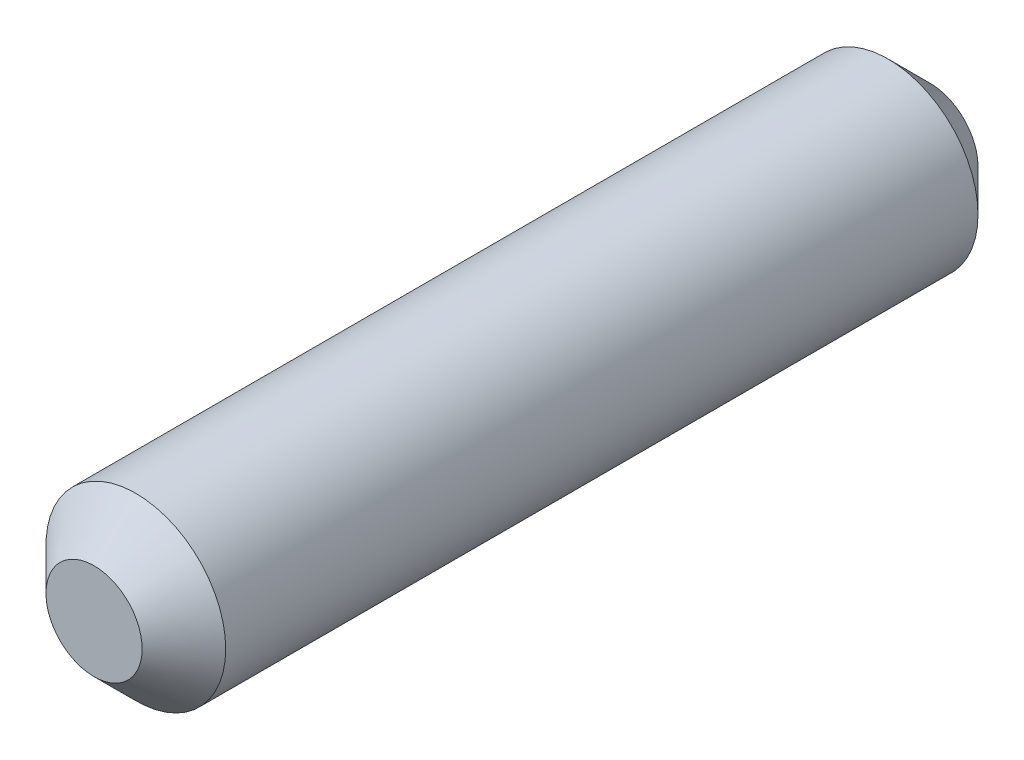
ISO-10303-21;
HEADER;
FILE_DESCRIPTION(('STEP AP214'),'2;1');
FILE_NAME('part.step','',(''),(''),'','','');
FILE_SCHEMA(('AUTOMOTIVE_DESIGN { 1 0 10303 214 1 1 1 1 }'));
ENDSEC;
DATA;
#1=APPLICATION_CONTEXT('core data for automotive mechanical design processes');
#2=APPLICATION_PROTOCOL_DEFINITION('international standard','automotive_design',2000,#1);
#3=PRODUCT_CONTEXT('',#1,'mechanical');
#4=PRODUCT('Part','Part','',(#3));
#5=PRODUCT_RELATED_PRODUCT_CATEGORY('part','',(#4));
#6=PRODUCT_DEFINITION_FORMATION('','',#4);
#7=PRODUCT_DEFINITION_CONTEXT('part definition',#1,'design');
#8=PRODUCT_DEFINITION('design','',#6,#7);
#9=PRODUCT_DEFINITION_SHAPE('','',#8);
#10=(LENGTH_UNIT() NAMED_UNIT(*) SI_UNIT(.MILLI.,.METRE.));
#11=(NAMED_UNIT(*) PLANE_ANGLE_UNIT() SI_UNIT($,.RADIAN.));
#12=(NAMED_UNIT(*) SI_UNIT($,.STERADIAN.) SOLID_ANGLE_UNIT());
#13=UNCERTAINTY_MEASURE_WITH_UNIT(LENGTH_MEASURE(1.E-05),#10,'distance_accuracy_value','');
#14=(GEOMETRIC_REPRESENTATION_CONTEXT(3) GLOBAL_UNCERTAINTY_ASSIGNED_CONTEXT((#13)) GLOBAL_UNIT_ASSIGNED_CONTEXT((#10,
#11,#12)) REPRESENTATION_CONTEXT('',''));
#15=CARTESIAN_POINT('',(0.,0.,0.));
#16=DIRECTION('',(0.,0.,1.));
#17=DIRECTION('',(1.,0.,0.));
#18=AXIS2_PLACEMENT_3D('',#15,#16,#17);
#19=CARTESIAN_POINT('',(0.,0.,10.));
#20=DIRECTION('',(0.,0.,-1.));
#21=DIRECTION('',(-1.,0.,0.));
#22=AXIS2_PLACEMENT_3D('',#19,#20,#21);
#23=CYLINDRICAL_SURFACE('',#22,1.075);
#24=CARTESIAN_POINT('',(0.,0.,0.500000000000002));
#25=DIRECTION('',(0.,0.,1.));
#26=DIRECTION('',(1.,0.,0.));
#27=AXIS2_PLACEMENT_3D('',#24,#25,#26);
#28=CIRCLE('',#27,1.075);
#29=CARTESIAN_POINT('',(1.075,0.,0.500000000000002));
#30=VERTEX_POINT('',#29);
#31=EDGE_CURVE('E53',#30,#30,#28,.T.);
#32=ORIENTED_EDGE('',*,*,#31,.T.);
#33=EDGE_LOOP('',(#32));
#34=FACE_BOUND('',#33,.T.);
#35=CARTESIAN_POINT('',(0.,0.,9.5));
#36=DIRECTION('',(0.,0.,1.));
#37=DIRECTION('',(1.,0.,0.));
#38=AXIS2_PLACEMENT_3D('',#35,#36,#37);
#39=CIRCLE('',#38,1.075);
#40=CARTESIAN_POINT('',(1.075,0.,9.5));
#41=VERTEX_POINT('',#40);
#42=EDGE_CURVE('E58',#41,#41,#39,.F.);
#43=ORIENTED_EDGE('',*,*,#42,.T.);
#44=EDGE_LOOP('',(#43));
#45=FACE_BOUND('',#44,.T.);
#46=ADVANCED_FACE('F39',(#34,#45),#23,.T.);
#47=CARTESIAN_POINT('',(0.,0.,10.));
#48=DIRECTION('',(0.,0.,1.));
#49=DIRECTION('',(1.,0.,0.));
#50=AXIS2_PLACEMENT_3D('',#47,#48,#49);
#51=PLANE('',#50);
#52=CARTESIAN_POINT('',(0.,0.,10.));
#53=DIRECTION('',(0.,0.,1.));
#54=DIRECTION('',(1.,0.,0.));
#55=AXIS2_PLACEMENT_3D('',#52,#53,#54);
#56=CIRCLE('',#55,0.575000000000001);
#57=CARTESIAN_POINT('',(0.575000000000001,0.,10.));
#58=VERTEX_POINT('',#57);
#59=EDGE_CURVE('E10',#58,#58,#56,.T.);
#60=ORIENTED_EDGE('',*,*,#59,.T.);
#61=EDGE_LOOP('',(#60));
#62=FACE_BOUND('',#61,.T.);
#63=ADVANCED_FACE('F75',(#62),#51,.T.);
#64=CARTESIAN_POINT('',(0.,0.,0.));
#65=DIRECTION('',(0.,0.,1.));
#66=DIRECTION('',(1.,0.,0.));
#67=AXIS2_PLACEMENT_3D('',#64,#65,#66);
#68=PLANE('',#67);
#69=CARTESIAN_POINT('',(0.,0.,0.));
#70=DIRECTION('',(0.,0.,1.));
#71=DIRECTION('',(1.,0.,0.));
#72=AXIS2_PLACEMENT_3D('',#69,#70,#71);
#73=CIRCLE('',#72,0.574999999999996);
#74=CARTESIAN_POINT('',(0.574999999999996,0.,0.));
#75=VERTEX_POINT('',#74);
#76=EDGE_CURVE('E48',#75,#75,#73,.F.);
#77=ORIENTED_EDGE('',*,*,#76,.T.);
#78=EDGE_LOOP('',(#77));
#79=FACE_BOUND('',#78,.T.);
#80=ADVANCED_FACE('F72',(#79),#68,.F.);
#81=CARTESIAN_POINT('',(0.,0.,0.500000000000002));
#82=DIRECTION('',(0.,0.,1.));
#83=DIRECTION('',(1.,0.,0.));
#84=AXIS2_PLACEMENT_3D('',#81,#82,#83);
#85=CONICAL_SURFACE('',#84,1.075,0.78539816339745);
#86=ORIENTED_EDGE('',*,*,#76,.F.);
#87=EDGE_LOOP('',(#86));
#88=FACE_BOUND('',#87,.T.);
#89=ORIENTED_EDGE('',*,*,#31,.F.);
#90=EDGE_LOOP('',(#89));
#91=FACE_BOUND('',#90,.T.);
#92=ADVANCED_FACE('F68',(#88,#91),#85,.T.);
#93=CARTESIAN_POINT('',(0.,0.,10.));
#94=DIRECTION('',(0.,0.,-1.));
#95=DIRECTION('',(-1.,0.,0.));
#96=AXIS2_PLACEMENT_3D('',#93,#94,#95);
#97=CONICAL_SURFACE('',#96,0.575000000000001,0.785398163397447);
#98=ORIENTED_EDGE('',*,*,#42,.F.);
#99=EDGE_LOOP('',(#98));
#100=FACE_BOUND('',#99,.T.);
#101=ORIENTED_EDGE('',*,*,#59,.F.);
#102=EDGE_LOOP('',(#101));
#103=FACE_BOUND('',#102,.T.);
#104=ADVANCED_FACE('F42',(#100,#103),#97,.T.);
#105=CLOSED_SHELL('',(#46,#63,#80,#92,#104));
#106=MANIFOLD_SOLID_BREP('B2',#105);
#107=ADVANCED_BREP_SHAPE_REPRESENTATION('',(#18,#106),#14);
#108=SHAPE_DEFINITION_REPRESENTATION(#9,#107);
ENDSEC;
END-ISO-10303-21;
